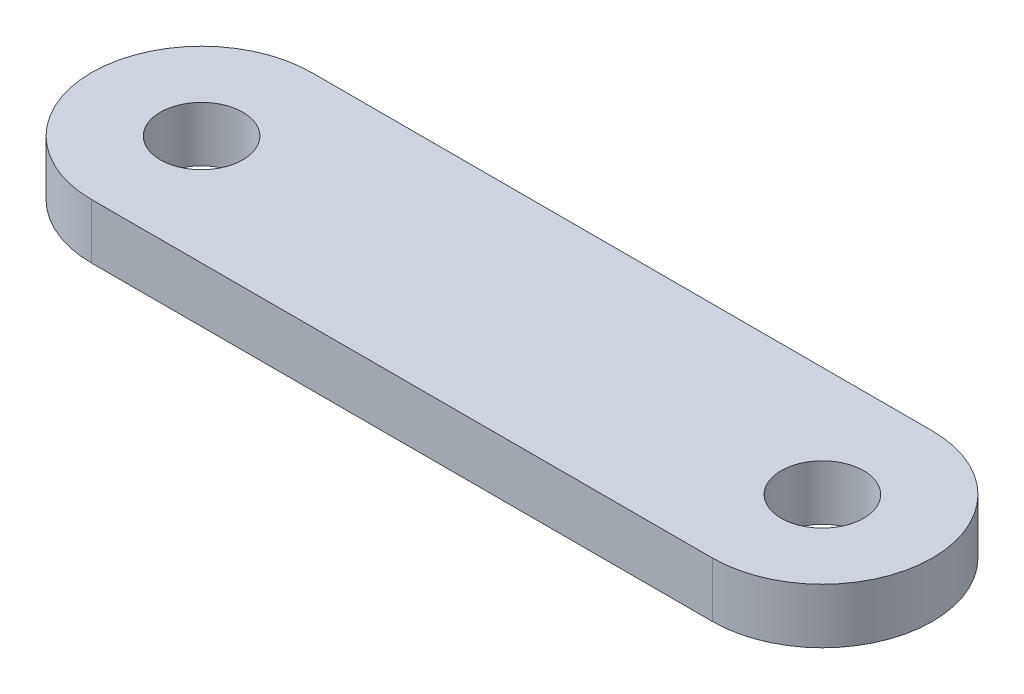
ISO-10303-21;
HEADER;
FILE_DESCRIPTION(('STEP AP214'),'2;1');
FILE_NAME('part.step','',(''),(''),'','','');
FILE_SCHEMA(('AUTOMOTIVE_DESIGN { 1 0 10303 214 1 1 1 1 }'));
ENDSEC;
DATA;
#1=APPLICATION_CONTEXT('core data for automotive mechanical design processes');
#2=APPLICATION_PROTOCOL_DEFINITION('international standard','automotive_design',2000,#1);
#3=PRODUCT_CONTEXT('',#1,'mechanical');
#4=PRODUCT('Part','Part','',(#3));
#5=PRODUCT_RELATED_PRODUCT_CATEGORY('part','',(#4));
#6=PRODUCT_DEFINITION_FORMATION('','',#4);
#7=PRODUCT_DEFINITION_CONTEXT('part definition',#1,'design');
#8=PRODUCT_DEFINITION('design','',#6,#7);
#9=PRODUCT_DEFINITION_SHAPE('','',#8);
#10=(LENGTH_UNIT() NAMED_UNIT(*) SI_UNIT(.MILLI.,.METRE.));
#11=(NAMED_UNIT(*) PLANE_ANGLE_UNIT() SI_UNIT($,.RADIAN.));
#12=(NAMED_UNIT(*) SI_UNIT($,.STERADIAN.) SOLID_ANGLE_UNIT());
#13=UNCERTAINTY_MEASURE_WITH_UNIT(LENGTH_MEASURE(1.E-05),#10,'distance_accuracy_value','');
#14=(GEOMETRIC_REPRESENTATION_CONTEXT(3) GLOBAL_UNCERTAINTY_ASSIGNED_CONTEXT((#13)) GLOBAL_UNIT_ASSIGNED_CONTEXT((#10,
#11,#12)) REPRESENTATION_CONTEXT('',''));
#15=CARTESIAN_POINT('',(0.,0.,0.));
#16=DIRECTION('',(0.,0.,1.));
#17=DIRECTION('',(1.,0.,0.));
#18=AXIS2_PLACEMENT_3D('',#15,#16,#17);
#19=CARTESIAN_POINT('',(-14.33195,2.54,0.));
#20=DIRECTION('',(0.,1.,0.));
#21=DIRECTION('',(0.,0.,1.));
#22=AXIS2_PLACEMENT_3D('',#19,#20,#21);
#23=PLANE('',#22);
#24=CARTESIAN_POINT('',(-14.33195,2.54,0.));
#25=DIRECTION('',(0.,1.,0.));
#26=DIRECTION('',(0.,0.,1.));
#27=AXIS2_PLACEMENT_3D('',#24,#25,#26);
#28=CIRCLE('',#27,1.905);
#29=CARTESIAN_POINT('',(-14.33195,2.54,1.905));
#30=VERTEX_POINT('',#29);
#31=EDGE_CURVE('E100',#30,#30,#28,.T.);
#32=ORIENTED_EDGE('',*,*,#31,.F.);
#33=EDGE_LOOP('',(#32));
#34=FACE_BOUND('',#33,.T.);
#35=CARTESIAN_POINT('',(-14.33195,2.54,0.));
#36=DIRECTION('',(0.,1.,0.));
#37=DIRECTION('',(0.,0.,1.));
#38=AXIS2_PLACEMENT_3D('',#35,#36,#37);
#39=CIRCLE('',#38,5.08);
#40=CARTESIAN_POINT('',(-14.33195,2.54,-5.08));
#41=VERTEX_POINT('',#40);
#42=CARTESIAN_POINT('',(-14.33195,2.54,5.08));
#43=VERTEX_POINT('',#42);
#44=EDGE_CURVE('E85',#41,#43,#39,.T.);
#45=ORIENTED_EDGE('',*,*,#44,.T.);
#46=DIRECTION('',(1.,0.,0.));
#47=VECTOR('',#46,1.);
#48=CARTESIAN_POINT('',(-14.33195,2.54,5.08));
#49=LINE('',#48,#47);
#50=CARTESIAN_POINT('',(14.33195,2.54,5.08));
#51=VERTEX_POINT('',#50);
#52=EDGE_CURVE('E80',#43,#51,#49,.T.);
#53=ORIENTED_EDGE('',*,*,#52,.T.);
#54=CARTESIAN_POINT('',(14.33195,2.54,0.));
#55=DIRECTION('',(0.,1.,0.));
#56=DIRECTION('',(0.,0.,1.));
#57=AXIS2_PLACEMENT_3D('',#54,#55,#56);
#58=CIRCLE('',#57,5.08);
#59=CARTESIAN_POINT('',(14.33195,2.54,-5.08000000000001));
#60=VERTEX_POINT('',#59);
#61=EDGE_CURVE('E83',#51,#60,#58,.T.);
#62=ORIENTED_EDGE('',*,*,#61,.T.);
#63=DIRECTION('',(-1.,0.,0.));
#64=VECTOR('',#63,1.);
#65=CARTESIAN_POINT('',(-14.33195,2.54,-5.08));
#66=LINE('',#65,#64);
#67=EDGE_CURVE('E50',#60,#41,#66,.T.);
#68=ORIENTED_EDGE('',*,*,#67,.T.);
#69=EDGE_LOOP('',(#45,#53,#62,#68));
#70=FACE_BOUND('',#69,.T.);
#71=CARTESIAN_POINT('',(14.33195,2.54,0.));
#72=DIRECTION('',(0.,1.,0.));
#73=DIRECTION('',(0.,0.,1.));
#74=AXIS2_PLACEMENT_3D('',#71,#72,#73);
#75=CIRCLE('',#74,1.905);
#76=CARTESIAN_POINT('',(14.33195,2.54,1.90499999999999));
#77=VERTEX_POINT('',#76);
#78=EDGE_CURVE('E115',#77,#77,#75,.T.);
#79=ORIENTED_EDGE('',*,*,#78,.F.);
#80=EDGE_LOOP('',(#79));
#81=FACE_BOUND('',#80,.T.);
#82=ADVANCED_FACE('F33',(#34,#70,#81),#23,.T.);
#83=CARTESIAN_POINT('',(-14.33195,0.,0.));
#84=DIRECTION('',(0.,1.,0.));
#85=DIRECTION('',(0.,0.,1.));
#86=AXIS2_PLACEMENT_3D('',#83,#84,#85);
#87=PLANE('',#86);
#88=CARTESIAN_POINT('',(-14.33195,0.,0.));
#89=DIRECTION('',(0.,1.,0.));
#90=DIRECTION('',(0.,0.,1.));
#91=AXIS2_PLACEMENT_3D('',#88,#89,#90);
#92=CIRCLE('',#91,5.08);
#93=CARTESIAN_POINT('',(-14.33195,0.,-5.08));
#94=VERTEX_POINT('',#93);
#95=CARTESIAN_POINT('',(-14.33195,0.,5.08));
#96=VERTEX_POINT('',#95);
#97=EDGE_CURVE('E97',#94,#96,#92,.T.);
#98=ORIENTED_EDGE('',*,*,#97,.F.);
#99=DIRECTION('',(-1.,0.,0.));
#100=VECTOR('',#99,1.);
#101=CARTESIAN_POINT('',(-14.33195,0.,-5.08));
#102=LINE('',#101,#100);
#103=CARTESIAN_POINT('',(14.33195,0.,-5.08000000000001));
#104=VERTEX_POINT('',#103);
#105=EDGE_CURVE('E73',#104,#94,#102,.T.);
#106=ORIENTED_EDGE('',*,*,#105,.F.);
#107=CARTESIAN_POINT('',(14.33195,0.,0.));
#108=DIRECTION('',(0.,1.,0.));
#109=DIRECTION('',(0.,0.,1.));
#110=AXIS2_PLACEMENT_3D('',#107,#108,#109);
#111=CIRCLE('',#110,5.08);
#112=CARTESIAN_POINT('',(14.33195,0.,5.08));
#113=VERTEX_POINT('',#112);
#114=EDGE_CURVE('E67',#113,#104,#111,.T.);
#115=ORIENTED_EDGE('',*,*,#114,.F.);
#116=DIRECTION('',(1.,0.,0.));
#117=VECTOR('',#116,1.);
#118=CARTESIAN_POINT('',(-14.33195,0.,5.08));
#119=LINE('',#118,#117);
#120=EDGE_CURVE('E89',#96,#113,#119,.T.);
#121=ORIENTED_EDGE('',*,*,#120,.F.);
#122=EDGE_LOOP('',(#98,#106,#115,#121));
#123=FACE_BOUND('',#122,.T.);
#124=CARTESIAN_POINT('',(-14.33195,0.,0.));
#125=DIRECTION('',(0.,1.,0.));
#126=DIRECTION('',(0.,0.,1.));
#127=AXIS2_PLACEMENT_3D('',#124,#125,#126);
#128=CIRCLE('',#127,1.905);
#129=CARTESIAN_POINT('',(-14.33195,0.,1.905));
#130=VERTEX_POINT('',#129);
#131=EDGE_CURVE('E112',#130,#130,#128,.T.);
#132=ORIENTED_EDGE('',*,*,#131,.T.);
#133=EDGE_LOOP('',(#132));
#134=FACE_BOUND('',#133,.T.);
#135=CARTESIAN_POINT('',(14.33195,0.,0.));
#136=DIRECTION('',(0.,1.,0.));
#137=DIRECTION('',(0.,0.,1.));
#138=AXIS2_PLACEMENT_3D('',#135,#136,#137);
#139=CIRCLE('',#138,1.905);
#140=CARTESIAN_POINT('',(14.33195,0.,1.90499999999999));
#141=VERTEX_POINT('',#140);
#142=EDGE_CURVE('E118',#141,#141,#139,.T.);
#143=ORIENTED_EDGE('',*,*,#142,.T.);
#144=EDGE_LOOP('',(#143));
#145=FACE_BOUND('',#144,.T.);
#146=ADVANCED_FACE('F108',(#123,#134,#145),#87,.F.);
#147=CARTESIAN_POINT('',(-14.33195,2.54,0.));
#148=DIRECTION('',(0.,-1.,0.));
#149=DIRECTION('',(0.,0.,-1.));
#150=AXIS2_PLACEMENT_3D('',#147,#148,#149);
#151=CYLINDRICAL_SURFACE('',#150,5.08);
#152=ORIENTED_EDGE('',*,*,#97,.T.);
#153=DIRECTION('',(0.,-1.,0.));
#154=VECTOR('',#153,1.);
#155=CARTESIAN_POINT('',(-14.33195,2.54,5.08));
#156=LINE('',#155,#154);
#157=EDGE_CURVE('E11',#43,#96,#156,.T.);
#158=ORIENTED_EDGE('',*,*,#157,.F.);
#159=ORIENTED_EDGE('',*,*,#44,.F.);
#160=DIRECTION('',(0.,-1.,0.));
#161=VECTOR('',#160,1.);
#162=CARTESIAN_POINT('',(-14.33195,2.54,-5.08));
#163=LINE('',#162,#161);
#164=EDGE_CURVE('E93',#41,#94,#163,.T.);
#165=ORIENTED_EDGE('',*,*,#164,.T.);
#166=EDGE_LOOP('',(#152,#158,#159,#165));
#167=FACE_BOUND('',#166,.T.);
#168=ADVANCED_FACE('F35',(#167),#151,.T.);
#169=CARTESIAN_POINT('',(-14.33195,2.54,5.08));
#170=DIRECTION('',(0.,0.,-1.));
#171=DIRECTION('',(-1.,0.,0.));
#172=AXIS2_PLACEMENT_3D('',#169,#170,#171);
#173=PLANE('',#172);
#174=ORIENTED_EDGE('',*,*,#120,.T.);
#175=DIRECTION('',(0.,-1.,0.));
#176=VECTOR('',#175,1.);
#177=CARTESIAN_POINT('',(14.33195,2.54,5.08));
#178=LINE('',#177,#176);
#179=EDGE_CURVE('E42',#51,#113,#178,.T.);
#180=ORIENTED_EDGE('',*,*,#179,.F.);
#181=ORIENTED_EDGE('',*,*,#52,.F.);
#182=ORIENTED_EDGE('',*,*,#157,.T.);
#183=EDGE_LOOP('',(#174,#180,#181,#182));
#184=FACE_BOUND('',#183,.T.);
#185=ADVANCED_FACE('F88',(#184),#173,.F.);
#186=CARTESIAN_POINT('',(14.33195,2.54,0.));
#187=DIRECTION('',(0.,-1.,0.));
#188=DIRECTION('',(0.,0.,-1.));
#189=AXIS2_PLACEMENT_3D('',#186,#187,#188);
#190=CYLINDRICAL_SURFACE('',#189,5.08);
#191=ORIENTED_EDGE('',*,*,#114,.T.);
#192=DIRECTION('',(0.,-1.,0.));
#193=VECTOR('',#192,1.);
#194=CARTESIAN_POINT('',(14.33195,2.54,-5.08000000000001));
#195=LINE('',#194,#193);
#196=EDGE_CURVE('E90',#60,#104,#195,.T.);
#197=ORIENTED_EDGE('',*,*,#196,.F.);
#198=ORIENTED_EDGE('',*,*,#61,.F.);
#199=ORIENTED_EDGE('',*,*,#179,.T.);
#200=EDGE_LOOP('',(#191,#197,#198,#199));
#201=FACE_BOUND('',#200,.T.);
#202=ADVANCED_FACE('F91',(#201),#190,.T.);
#203=CARTESIAN_POINT('',(-14.33195,2.54,-5.08));
#204=DIRECTION('',(0.,0.,1.));
#205=DIRECTION('',(1.,0.,0.));
#206=AXIS2_PLACEMENT_3D('',#203,#204,#205);
#207=PLANE('',#206);
#208=ORIENTED_EDGE('',*,*,#105,.T.);
#209=ORIENTED_EDGE('',*,*,#164,.F.);
#210=ORIENTED_EDGE('',*,*,#67,.F.);
#211=ORIENTED_EDGE('',*,*,#196,.T.);
#212=EDGE_LOOP('',(#208,#209,#210,#211));
#213=FACE_BOUND('',#212,.T.);
#214=ADVANCED_FACE('F105',(#213),#207,.F.);
#215=CARTESIAN_POINT('',(-14.33195,2.54,0.));
#216=DIRECTION('',(0.,-1.,0.));
#217=DIRECTION('',(0.,0.,-1.));
#218=AXIS2_PLACEMENT_3D('',#215,#216,#217);
#219=CYLINDRICAL_SURFACE('',#218,1.905);
#220=ORIENTED_EDGE('',*,*,#31,.T.);
#221=EDGE_LOOP('',(#220));
#222=FACE_BOUND('',#221,.T.);
#223=ORIENTED_EDGE('',*,*,#131,.F.);
#224=EDGE_LOOP('',(#223));
#225=FACE_BOUND('',#224,.T.);
#226=ADVANCED_FACE('F135',(#222,#225),#219,.F.);
#227=CARTESIAN_POINT('',(14.33195,2.54,0.));
#228=DIRECTION('',(0.,-1.,0.));
#229=DIRECTION('',(0.,0.,-1.));
#230=AXIS2_PLACEMENT_3D('',#227,#228,#229);
#231=CYLINDRICAL_SURFACE('',#230,1.905);
#232=ORIENTED_EDGE('',*,*,#78,.T.);
#233=EDGE_LOOP('',(#232));
#234=FACE_BOUND('',#233,.T.);
#235=ORIENTED_EDGE('',*,*,#142,.F.);
#236=EDGE_LOOP('',(#235));
#237=FACE_BOUND('',#236,.T.);
#238=ADVANCED_FACE('F124',(#234,#237),#231,.F.);
#239=CLOSED_SHELL('',(#82,#146,#168,#185,#202,#214,#226,#238));
#240=MANIFOLD_SOLID_BREP('B2',#239);
#241=ADVANCED_BREP_SHAPE_REPRESENTATION('',(#18,#240),#14);
#242=SHAPE_DEFINITION_REPRESENTATION(#9,#241);
ENDSEC;
END-ISO-10303-21;
